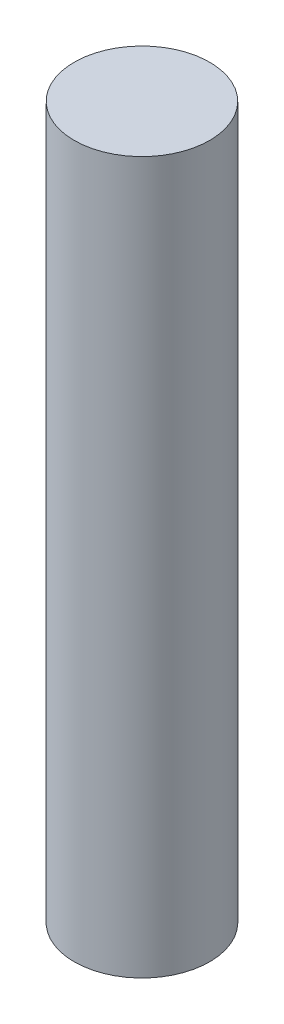
ISO-10303-21;
HEADER;
FILE_DESCRIPTION(('STEP AP214'),'2;1');
FILE_NAME('part.step','',(''),(''),'','','');
FILE_SCHEMA(('AUTOMOTIVE_DESIGN { 1 0 10303 214 1 1 1 1 }'));
ENDSEC;
DATA;
#1=APPLICATION_CONTEXT('core data for automotive mechanical design processes');
#2=APPLICATION_PROTOCOL_DEFINITION('international standard','automotive_design',2000,#1);
#3=PRODUCT_CONTEXT('',#1,'mechanical');
#4=PRODUCT('Part','Part','',(#3));
#5=PRODUCT_RELATED_PRODUCT_CATEGORY('part','',(#4));
#6=PRODUCT_DEFINITION_FORMATION('','',#4);
#7=PRODUCT_DEFINITION_CONTEXT('part definition',#1,'design');
#8=PRODUCT_DEFINITION('design','',#6,#7);
#9=PRODUCT_DEFINITION_SHAPE('','',#8);
#10=(LENGTH_UNIT() NAMED_UNIT(*) SI_UNIT(.MILLI.,.METRE.));
#11=(NAMED_UNIT(*) PLANE_ANGLE_UNIT() SI_UNIT($,.RADIAN.));
#12=(NAMED_UNIT(*) SI_UNIT($,.STERADIAN.) SOLID_ANGLE_UNIT());
#13=UNCERTAINTY_MEASURE_WITH_UNIT(LENGTH_MEASURE(1.E-05),#10,'distance_accuracy_value','');
#14=(GEOMETRIC_REPRESENTATION_CONTEXT(3) GLOBAL_UNCERTAINTY_ASSIGNED_CONTEXT((#13)) GLOBAL_UNIT_ASSIGNED_CONTEXT((#10,
#11,#12)) REPRESENTATION_CONTEXT('',''));
#15=CARTESIAN_POINT('',(0.,0.,0.));
#16=DIRECTION('',(0.,0.,1.));
#17=DIRECTION('',(1.,0.,0.));
#18=AXIS2_PLACEMENT_3D('',#15,#16,#17);
#19=CARTESIAN_POINT('',(0.,8.,0.));
#20=DIRECTION('',(0.,-1.,0.));
#21=DIRECTION('',(0.,0.,-1.));
#22=AXIS2_PLACEMENT_3D('',#19,#20,#21);
#23=CYLINDRICAL_SURFACE('',#22,2.);
#24=CARTESIAN_POINT('',(0.,8.,0.));
#25=DIRECTION('',(0.,1.,0.));
#26=DIRECTION('',(0.,0.,1.));
#27=AXIS2_PLACEMENT_3D('',#24,#25,#26);
#28=CIRCLE('',#27,2.);
#29=CARTESIAN_POINT('',(0.,8.,2.));
#30=VERTEX_POINT('',#29);
#31=EDGE_CURVE('E10',#30,#30,#28,.T.);
#32=ORIENTED_EDGE('',*,*,#31,.F.);
#33=EDGE_LOOP('',(#32));
#34=FACE_BOUND('',#33,.T.);
#35=CARTESIAN_POINT('',(0.,-13.,0.));
#36=DIRECTION('',(0.,1.,0.));
#37=DIRECTION('',(0.,0.,1.));
#38=AXIS2_PLACEMENT_3D('',#35,#36,#37);
#39=CIRCLE('',#38,2.);
#40=CARTESIAN_POINT('',(0.,-13.,2.));
#41=VERTEX_POINT('',#40);
#42=EDGE_CURVE('E36',#41,#41,#39,.T.);
#43=ORIENTED_EDGE('',*,*,#42,.T.);
#44=EDGE_LOOP('',(#43));
#45=FACE_BOUND('',#44,.T.);
#46=ADVANCED_FACE('F30',(#34,#45),#23,.T.);
#47=CARTESIAN_POINT('',(0.,8.,0.));
#48=DIRECTION('',(0.,1.,0.));
#49=DIRECTION('',(0.,0.,1.));
#50=AXIS2_PLACEMENT_3D('',#47,#48,#49);
#51=PLANE('',#50);
#52=ORIENTED_EDGE('',*,*,#31,.T.);
#53=EDGE_LOOP('',(#52));
#54=FACE_BOUND('',#53,.T.);
#55=ADVANCED_FACE('F45',(#54),#51,.T.);
#56=CARTESIAN_POINT('',(0.,-13.,0.));
#57=DIRECTION('',(0.,1.,0.));
#58=DIRECTION('',(0.,0.,1.));
#59=AXIS2_PLACEMENT_3D('',#56,#57,#58);
#60=PLANE('',#59);
#61=ORIENTED_EDGE('',*,*,#42,.F.);
#62=EDGE_LOOP('',(#61));
#63=FACE_BOUND('',#62,.T.);
#64=ADVANCED_FACE('F43',(#63),#60,.F.);
#65=CLOSED_SHELL('',(#46,#55,#64));
#66=MANIFOLD_SOLID_BREP('B2',#65);
#67=ADVANCED_BREP_SHAPE_REPRESENTATION('',(#18,#66),#14);
#68=SHAPE_DEFINITION_REPRESENTATION(#9,#67);
ENDSEC;
END-ISO-10303-21;
